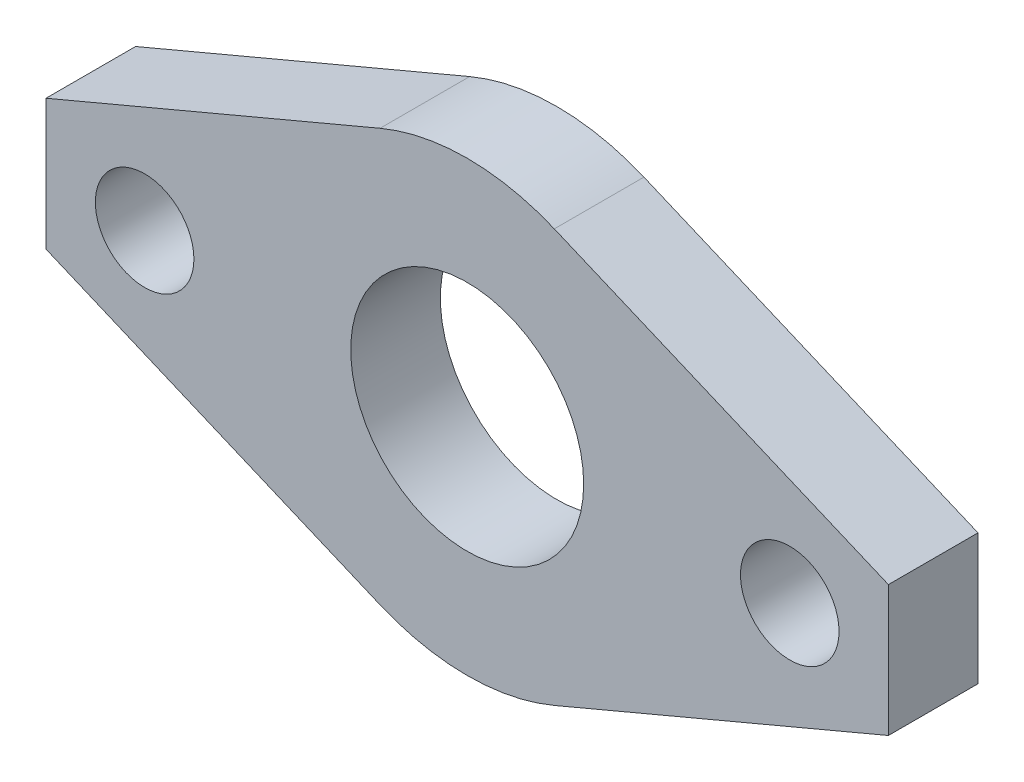
ISO-10303-21;
HEADER;
FILE_DESCRIPTION(('STEP AP214'),'2;1');
FILE_NAME('part.step','',(''),(''),'','','');
FILE_SCHEMA(('AUTOMOTIVE_DESIGN { 1 0 10303 214 1 1 1 1 }'));
ENDSEC;
DATA;
#1=APPLICATION_CONTEXT('core data for automotive mechanical design processes');
#2=APPLICATION_PROTOCOL_DEFINITION('international standard','automotive_design',2000,#1);
#3=PRODUCT_CONTEXT('',#1,'mechanical');
#4=PRODUCT('Part','Part','',(#3));
#5=PRODUCT_RELATED_PRODUCT_CATEGORY('part','',(#4));
#6=PRODUCT_DEFINITION_FORMATION('','',#4);
#7=PRODUCT_DEFINITION_CONTEXT('part definition',#1,'design');
#8=PRODUCT_DEFINITION('design','',#6,#7);
#9=PRODUCT_DEFINITION_SHAPE('','',#8);
#10=(LENGTH_UNIT() NAMED_UNIT(*) SI_UNIT(.MILLI.,.METRE.));
#11=(NAMED_UNIT(*) PLANE_ANGLE_UNIT() SI_UNIT($,.RADIAN.));
#12=(NAMED_UNIT(*) SI_UNIT($,.STERADIAN.) SOLID_ANGLE_UNIT());
#13=UNCERTAINTY_MEASURE_WITH_UNIT(LENGTH_MEASURE(1.E-05),#10,'distance_accuracy_value','');
#14=(GEOMETRIC_REPRESENTATION_CONTEXT(3) GLOBAL_UNCERTAINTY_ASSIGNED_CONTEXT((#13)) GLOBAL_UNIT_ASSIGNED_CONTEXT((#10,
#11,#12)) REPRESENTATION_CONTEXT('',''));
#15=CARTESIAN_POINT('',(0.,0.,0.));
#16=DIRECTION('',(0.,0.,1.));
#17=DIRECTION('',(1.,0.,0.));
#18=AXIS2_PLACEMENT_3D('',#15,#16,#17);
#19=CARTESIAN_POINT('',(0.,16.,5.));
#20=DIRECTION('',(0.,0.,1.));
#21=DIRECTION('',(1.,0.,0.));
#22=AXIS2_PLACEMENT_3D('',#19,#20,#21);
#23=PLANE('',#22);
#24=CARTESIAN_POINT('',(-18.,16.,5.));
#25=DIRECTION('',(0.,0.,1.));
#26=DIRECTION('',(1.,0.,0.));
#27=AXIS2_PLACEMENT_3D('',#24,#25,#26);
#28=CIRCLE('',#27,2.75);
#29=CARTESIAN_POINT('',(-15.25,16.,5.));
#30=VERTEX_POINT('',#29);
#31=EDGE_CURVE('E182',#30,#30,#28,.T.);
#32=ORIENTED_EDGE('',*,*,#31,.F.);
#33=EDGE_LOOP('',(#32));
#34=FACE_BOUND('',#33,.T.);
#35=CARTESIAN_POINT('',(0.,16.,5.));
#36=DIRECTION('',(0.,0.,1.));
#37=DIRECTION('',(1.,0.,0.));
#38=AXIS2_PLACEMENT_3D('',#35,#36,#37);
#39=CIRCLE('',#38,12.5);
#40=CARTESIAN_POINT('',(-4.86111111111111,4.48394170015486,5.));
#41=VERTEX_POINT('',#40);
#42=CARTESIAN_POINT('',(4.86111111111111,4.48394170015486,5.));
#43=VERTEX_POINT('',#42);
#44=EDGE_CURVE('E145',#41,#43,#39,.T.);
#45=ORIENTED_EDGE('',*,*,#44,.T.);
#46=DIRECTION('',(0.921284663987611,0.388888888888889,0.));
#47=VECTOR('',#46,1.);
#48=CARTESIAN_POINT('',(4.86111111111111,4.48394170015486,5.));
#49=LINE('',#48,#47);
#50=CARTESIAN_POINT('',(23.5036785252955,12.3532654945601,5.));
#51=VERTEX_POINT('',#50);
#52=EDGE_CURVE('E93',#43,#51,#49,.T.);
#53=ORIENTED_EDGE('',*,*,#52,.T.);
#54=DIRECTION('',(0.,1.,0.));
#55=VECTOR('',#54,1.);
#56=CARTESIAN_POINT('',(23.5036785252955,19.6467345054399,5.));
#57=LINE('',#56,#55);
#58=CARTESIAN_POINT('',(23.5036785252955,19.6467345054399,5.));
#59=VERTEX_POINT('',#58);
#60=EDGE_CURVE('E160',#51,#59,#57,.T.);
#61=ORIENTED_EDGE('',*,*,#60,.T.);
#62=DIRECTION('',(-0.921284663987611,0.388888888888889,0.));
#63=VECTOR('',#62,1.);
#64=CARTESIAN_POINT('',(4.86111111111111,27.5160582998451,5.));
#65=LINE('',#64,#63);
#66=CARTESIAN_POINT('',(4.86111111111111,27.5160582998451,5.));
#67=VERTEX_POINT('',#66);
#68=EDGE_CURVE('E173',#59,#67,#65,.T.);
#69=ORIENTED_EDGE('',*,*,#68,.T.);
#70=CARTESIAN_POINT('',(0.,16.,5.));
#71=DIRECTION('',(0.,0.,1.));
#72=DIRECTION('',(-1.,0.,0.));
#73=AXIS2_PLACEMENT_3D('',#70,#71,#72);
#74=CIRCLE('',#73,12.5);
#75=CARTESIAN_POINT('',(-4.86111111111111,27.5160582998451,5.));
#76=VERTEX_POINT('',#75);
#77=EDGE_CURVE('E112',#67,#76,#74,.T.);
#78=ORIENTED_EDGE('',*,*,#77,.T.);
#79=DIRECTION('',(-0.921284663987611,-0.388888888888889,0.));
#80=VECTOR('',#79,1.);
#81=CARTESIAN_POINT('',(-4.86111111111111,27.5160582998451,5.));
#82=LINE('',#81,#80);
#83=CARTESIAN_POINT('',(-23.5036785252955,19.6467345054399,5.));
#84=VERTEX_POINT('',#83);
#85=EDGE_CURVE('E106',#76,#84,#82,.T.);
#86=ORIENTED_EDGE('',*,*,#85,.T.);
#87=DIRECTION('',(0.,-1.,0.));
#88=VECTOR('',#87,1.);
#89=CARTESIAN_POINT('',(-23.5036785252955,19.6467345054399,5.));
#90=LINE('',#89,#88);
#91=CARTESIAN_POINT('',(-23.5036785252955,12.3532654945601,5.));
#92=VERTEX_POINT('',#91);
#93=EDGE_CURVE('E110',#84,#92,#90,.T.);
#94=ORIENTED_EDGE('',*,*,#93,.T.);
#95=DIRECTION('',(0.921284663987611,-0.388888888888889,0.));
#96=VECTOR('',#95,1.);
#97=CARTESIAN_POINT('',(-4.86111111111111,4.48394170015486,5.));
#98=LINE('',#97,#96);
#99=EDGE_CURVE('E50',#92,#41,#98,.T.);
#100=ORIENTED_EDGE('',*,*,#99,.T.);
#101=EDGE_LOOP('',(#45,#53,#61,#69,#78,#86,#94,#100));
#102=FACE_BOUND('',#101,.T.);
#103=CARTESIAN_POINT('',(0.,16.,5.));
#104=DIRECTION('',(0.,0.,1.));
#105=DIRECTION('',(1.,0.,0.));
#106=AXIS2_PLACEMENT_3D('',#103,#104,#105);
#107=CIRCLE('',#106,6.5);
#108=CARTESIAN_POINT('',(6.5,16.,5.));
#109=VERTEX_POINT('',#108);
#110=EDGE_CURVE('E134',#109,#109,#107,.T.);
#111=ORIENTED_EDGE('',*,*,#110,.F.);
#112=EDGE_LOOP('',(#111));
#113=FACE_BOUND('',#112,.T.);
#114=CARTESIAN_POINT('',(18.,16.,5.));
#115=DIRECTION('',(0.,0.,1.));
#116=DIRECTION('',(1.,0.,0.));
#117=AXIS2_PLACEMENT_3D('',#114,#115,#116);
#118=CIRCLE('',#117,2.75);
#119=CARTESIAN_POINT('',(20.75,16.,5.));
#120=VERTEX_POINT('',#119);
#121=EDGE_CURVE('E188',#120,#120,#118,.T.);
#122=ORIENTED_EDGE('',*,*,#121,.F.);
#123=EDGE_LOOP('',(#122));
#124=FACE_BOUND('',#123,.T.);
#125=ADVANCED_FACE('F33',(#34,#102,#113,#124),#23,.T.);
#126=CARTESIAN_POINT('',(0.,16.,0.));
#127=DIRECTION('',(0.,0.,1.));
#128=DIRECTION('',(1.,0.,0.));
#129=AXIS2_PLACEMENT_3D('',#126,#127,#128);
#130=PLANE('',#129);
#131=CARTESIAN_POINT('',(-18.,16.,0.));
#132=DIRECTION('',(0.,0.,1.));
#133=DIRECTION('',(1.,0.,0.));
#134=AXIS2_PLACEMENT_3D('',#131,#132,#133);
#135=CIRCLE('',#134,2.75);
#136=CARTESIAN_POINT('',(-15.25,16.,0.));
#137=VERTEX_POINT('',#136);
#138=EDGE_CURVE('E185',#137,#137,#135,.T.);
#139=ORIENTED_EDGE('',*,*,#138,.T.);
#140=EDGE_LOOP('',(#139));
#141=FACE_BOUND('',#140,.T.);
#142=CARTESIAN_POINT('',(0.,16.,0.));
#143=DIRECTION('',(0.,0.,1.));
#144=DIRECTION('',(1.,0.,0.));
#145=AXIS2_PLACEMENT_3D('',#142,#143,#144);
#146=CIRCLE('',#145,12.5);
#147=CARTESIAN_POINT('',(-4.86111111111111,4.48394170015486,0.));
#148=VERTEX_POINT('',#147);
#149=CARTESIAN_POINT('',(4.86111111111111,4.48394170015486,0.));
#150=VERTEX_POINT('',#149);
#151=EDGE_CURVE('E130',#148,#150,#146,.T.);
#152=ORIENTED_EDGE('',*,*,#151,.F.);
#153=DIRECTION('',(0.921284663987611,-0.388888888888889,0.));
#154=VECTOR('',#153,1.);
#155=CARTESIAN_POINT('',(-4.86111111111111,4.48394170015486,0.));
#156=LINE('',#155,#154);
#157=CARTESIAN_POINT('',(-23.5036785252955,12.3532654945601,0.));
#158=VERTEX_POINT('',#157);
#159=EDGE_CURVE('E85',#158,#148,#156,.T.);
#160=ORIENTED_EDGE('',*,*,#159,.F.);
#161=DIRECTION('',(0.,-1.,0.));
#162=VECTOR('',#161,1.);
#163=CARTESIAN_POINT('',(-23.5036785252955,19.6467345054399,0.));
#164=LINE('',#163,#162);
#165=CARTESIAN_POINT('',(-23.5036785252955,19.6467345054399,0.));
#166=VERTEX_POINT('',#165);
#167=EDGE_CURVE('E79',#166,#158,#164,.T.);
#168=ORIENTED_EDGE('',*,*,#167,.F.);
#169=DIRECTION('',(-0.921284663987611,-0.388888888888889,0.));
#170=VECTOR('',#169,1.);
#171=CARTESIAN_POINT('',(-4.86111111111111,27.5160582998451,0.));
#172=LINE('',#171,#170);
#173=CARTESIAN_POINT('',(-4.86111111111111,27.5160582998451,0.));
#174=VERTEX_POINT('',#173);
#175=EDGE_CURVE('E120',#174,#166,#172,.T.);
#176=ORIENTED_EDGE('',*,*,#175,.F.);
#177=CARTESIAN_POINT('',(0.,16.,0.));
#178=DIRECTION('',(0.,0.,1.));
#179=DIRECTION('',(-1.,0.,0.));
#180=AXIS2_PLACEMENT_3D('',#177,#178,#179);
#181=CIRCLE('',#180,12.5);
#182=CARTESIAN_POINT('',(4.86111111111111,27.5160582998451,0.));
#183=VERTEX_POINT('',#182);
#184=EDGE_CURVE('E140',#183,#174,#181,.T.);
#185=ORIENTED_EDGE('',*,*,#184,.F.);
#186=DIRECTION('',(-0.921284663987611,0.388888888888889,0.));
#187=VECTOR('',#186,1.);
#188=CARTESIAN_POINT('',(4.86111111111111,27.5160582998451,0.));
#189=LINE('',#188,#187);
#190=CARTESIAN_POINT('',(23.5036785252955,19.6467345054399,0.));
#191=VERTEX_POINT('',#190);
#192=EDGE_CURVE('E138',#191,#183,#189,.T.);
#193=ORIENTED_EDGE('',*,*,#192,.F.);
#194=DIRECTION('',(0.,1.,0.));
#195=VECTOR('',#194,1.);
#196=CARTESIAN_POINT('',(23.5036785252955,19.6467345054399,0.));
#197=LINE('',#196,#195);
#198=CARTESIAN_POINT('',(23.5036785252955,12.3532654945601,0.));
#199=VERTEX_POINT('',#198);
#200=EDGE_CURVE('E136',#199,#191,#197,.T.);
#201=ORIENTED_EDGE('',*,*,#200,.F.);
#202=DIRECTION('',(0.921284663987611,0.388888888888889,0.));
#203=VECTOR('',#202,1.);
#204=CARTESIAN_POINT('',(4.86111111111111,4.48394170015486,0.));
#205=LINE('',#204,#203);
#206=EDGE_CURVE('E133',#150,#199,#205,.T.);
#207=ORIENTED_EDGE('',*,*,#206,.F.);
#208=EDGE_LOOP('',(#152,#160,#168,#176,#185,#193,#201,#207));
#209=FACE_BOUND('',#208,.T.);
#210=CARTESIAN_POINT('',(0.,16.,0.));
#211=DIRECTION('',(0.,0.,1.));
#212=DIRECTION('',(1.,0.,0.));
#213=AXIS2_PLACEMENT_3D('',#210,#211,#212);
#214=CIRCLE('',#213,6.5);
#215=CARTESIAN_POINT('',(6.5,16.,0.));
#216=VERTEX_POINT('',#215);
#217=EDGE_CURVE('E179',#216,#216,#214,.T.);
#218=ORIENTED_EDGE('',*,*,#217,.T.);
#219=EDGE_LOOP('',(#218));
#220=FACE_BOUND('',#219,.T.);
#221=CARTESIAN_POINT('',(18.,16.,0.));
#222=DIRECTION('',(0.,0.,1.));
#223=DIRECTION('',(1.,0.,0.));
#224=AXIS2_PLACEMENT_3D('',#221,#222,#223);
#225=CIRCLE('',#224,2.75);
#226=CARTESIAN_POINT('',(20.75,16.,0.));
#227=VERTEX_POINT('',#226);
#228=EDGE_CURVE('E191',#227,#227,#225,.T.);
#229=ORIENTED_EDGE('',*,*,#228,.T.);
#230=EDGE_LOOP('',(#229));
#231=FACE_BOUND('',#230,.T.);
#232=ADVANCED_FACE('F164',(#141,#209,#220,#231),#130,.F.);
#233=CARTESIAN_POINT('',(0.,16.,5.));
#234=DIRECTION('',(0.,0.,-1.));
#235=DIRECTION('',(-1.,0.,0.));
#236=AXIS2_PLACEMENT_3D('',#233,#234,#235);
#237=CYLINDRICAL_SURFACE('',#236,12.5);
#238=ORIENTED_EDGE('',*,*,#151,.T.);
#239=DIRECTION('',(0.,0.,-1.));
#240=VECTOR('',#239,1.);
#241=CARTESIAN_POINT('',(4.86111111111111,4.48394170015486,5.));
#242=LINE('',#241,#240);
#243=EDGE_CURVE('E11',#43,#150,#242,.T.);
#244=ORIENTED_EDGE('',*,*,#243,.F.);
#245=ORIENTED_EDGE('',*,*,#44,.F.);
#246=DIRECTION('',(0.,0.,-1.));
#247=VECTOR('',#246,1.);
#248=CARTESIAN_POINT('',(-4.86111111111111,4.48394170015486,5.));
#249=LINE('',#248,#247);
#250=EDGE_CURVE('E126',#41,#148,#249,.T.);
#251=ORIENTED_EDGE('',*,*,#250,.T.);
#252=EDGE_LOOP('',(#238,#244,#245,#251));
#253=FACE_BOUND('',#252,.T.);
#254=ADVANCED_FACE('F35',(#253),#237,.T.);
#255=CARTESIAN_POINT('',(4.86111111111111,4.48394170015486,5.));
#256=DIRECTION('',(-0.388888888888889,0.921284663987611,0.));
#257=DIRECTION('',(-0.921284663987611,-0.388888888888889,0.));
#258=AXIS2_PLACEMENT_3D('',#255,#256,#257);
#259=PLANE('',#258);
#260=ORIENTED_EDGE('',*,*,#206,.T.);
#261=DIRECTION('',(0.,0.,-1.));
#262=VECTOR('',#261,1.);
#263=CARTESIAN_POINT('',(23.5036785252955,12.3532654945601,5.));
#264=LINE('',#263,#262);
#265=EDGE_CURVE('E42',#51,#199,#264,.T.);
#266=ORIENTED_EDGE('',*,*,#265,.F.);
#267=ORIENTED_EDGE('',*,*,#52,.F.);
#268=ORIENTED_EDGE('',*,*,#243,.T.);
#269=EDGE_LOOP('',(#260,#266,#267,#268));
#270=FACE_BOUND('',#269,.T.);
#271=ADVANCED_FACE('F225',(#270),#259,.F.);
#272=CARTESIAN_POINT('',(23.5036785252955,19.6467345054399,5.));
#273=DIRECTION('',(-1.,0.,0.));
#274=DIRECTION('',(0.,0.,1.));
#275=AXIS2_PLACEMENT_3D('',#272,#273,#274);
#276=PLANE('',#275);
#277=ORIENTED_EDGE('',*,*,#200,.T.);
#278=DIRECTION('',(0.,0.,-1.));
#279=VECTOR('',#278,1.);
#280=CARTESIAN_POINT('',(23.5036785252955,19.6467345054399,5.));
#281=LINE('',#280,#279);
#282=EDGE_CURVE('E152',#59,#191,#281,.T.);
#283=ORIENTED_EDGE('',*,*,#282,.F.);
#284=ORIENTED_EDGE('',*,*,#60,.F.);
#285=ORIENTED_EDGE('',*,*,#265,.T.);
#286=EDGE_LOOP('',(#277,#283,#284,#285));
#287=FACE_BOUND('',#286,.T.);
#288=ADVANCED_FACE('F158',(#287),#276,.F.);
#289=CARTESIAN_POINT('',(4.86111111111111,27.5160582998451,5.));
#290=DIRECTION('',(-0.388888888888889,-0.921284663987611,0.));
#291=DIRECTION('',(0.921284663987611,-0.388888888888889,0.));
#292=AXIS2_PLACEMENT_3D('',#289,#290,#291);
#293=PLANE('',#292);
#294=ORIENTED_EDGE('',*,*,#192,.T.);
#295=DIRECTION('',(0.,0.,-1.));
#296=VECTOR('',#295,1.);
#297=CARTESIAN_POINT('',(4.86111111111111,27.5160582998451,5.));
#298=LINE('',#297,#296);
#299=EDGE_CURVE('E149',#67,#183,#298,.T.);
#300=ORIENTED_EDGE('',*,*,#299,.F.);
#301=ORIENTED_EDGE('',*,*,#68,.F.);
#302=ORIENTED_EDGE('',*,*,#282,.T.);
#303=EDGE_LOOP('',(#294,#300,#301,#302));
#304=FACE_BOUND('',#303,.T.);
#305=ADVANCED_FACE('F169',(#304),#293,.F.);
#306=CARTESIAN_POINT('',(0.,16.,5.));
#307=DIRECTION('',(0.,0.,-1.));
#308=DIRECTION('',(-1.,0.,0.));
#309=AXIS2_PLACEMENT_3D('',#306,#307,#308);
#310=CYLINDRICAL_SURFACE('',#309,12.5);
#311=ORIENTED_EDGE('',*,*,#184,.T.);
#312=DIRECTION('',(0.,0.,-1.));
#313=VECTOR('',#312,1.);
#314=CARTESIAN_POINT('',(-4.86111111111111,27.5160582998451,5.));
#315=LINE('',#314,#313);
#316=EDGE_CURVE('E121',#76,#174,#315,.T.);
#317=ORIENTED_EDGE('',*,*,#316,.F.);
#318=ORIENTED_EDGE('',*,*,#77,.F.);
#319=ORIENTED_EDGE('',*,*,#299,.T.);
#320=EDGE_LOOP('',(#311,#317,#318,#319));
#321=FACE_BOUND('',#320,.T.);
#322=ADVANCED_FACE('F172',(#321),#310,.T.);
#323=CARTESIAN_POINT('',(-4.86111111111111,27.5160582998451,5.));
#324=DIRECTION('',(0.388888888888889,-0.921284663987611,0.));
#325=DIRECTION('',(0.921284663987611,0.388888888888889,0.));
#326=AXIS2_PLACEMENT_3D('',#323,#324,#325);
#327=PLANE('',#326);
#328=ORIENTED_EDGE('',*,*,#175,.T.);
#329=DIRECTION('',(0.,0.,-1.));
#330=VECTOR('',#329,1.);
#331=CARTESIAN_POINT('',(-23.5036785252955,19.6467345054399,5.));
#332=LINE('',#331,#330);
#333=EDGE_CURVE('E117',#84,#166,#332,.T.);
#334=ORIENTED_EDGE('',*,*,#333,.F.);
#335=ORIENTED_EDGE('',*,*,#85,.F.);
#336=ORIENTED_EDGE('',*,*,#316,.T.);
#337=EDGE_LOOP('',(#328,#334,#335,#336));
#338=FACE_BOUND('',#337,.T.);
#339=ADVANCED_FACE('F118',(#338),#327,.F.);
#340=CARTESIAN_POINT('',(-23.5036785252955,19.6467345054399,5.));
#341=DIRECTION('',(1.,0.,0.));
#342=DIRECTION('',(0.,0.,-1.));
#343=AXIS2_PLACEMENT_3D('',#340,#341,#342);
#344=PLANE('',#343);
#345=ORIENTED_EDGE('',*,*,#167,.T.);
#346=DIRECTION('',(0.,0.,-1.));
#347=VECTOR('',#346,1.);
#348=CARTESIAN_POINT('',(-23.5036785252955,12.3532654945601,5.));
#349=LINE('',#348,#347);
#350=EDGE_CURVE('E122',#92,#158,#349,.T.);
#351=ORIENTED_EDGE('',*,*,#350,.F.);
#352=ORIENTED_EDGE('',*,*,#93,.F.);
#353=ORIENTED_EDGE('',*,*,#333,.T.);
#354=EDGE_LOOP('',(#345,#351,#352,#353));
#355=FACE_BOUND('',#354,.T.);
#356=ADVANCED_FACE('F124',(#355),#344,.F.);
#357=CARTESIAN_POINT('',(-4.86111111111111,4.48394170015486,5.));
#358=DIRECTION('',(0.388888888888889,0.921284663987611,0.));
#359=DIRECTION('',(-0.921284663987611,0.388888888888889,0.));
#360=AXIS2_PLACEMENT_3D('',#357,#358,#359);
#361=PLANE('',#360);
#362=ORIENTED_EDGE('',*,*,#159,.T.);
#363=ORIENTED_EDGE('',*,*,#250,.F.);
#364=ORIENTED_EDGE('',*,*,#99,.F.);
#365=ORIENTED_EDGE('',*,*,#350,.T.);
#366=EDGE_LOOP('',(#362,#363,#364,#365));
#367=FACE_BOUND('',#366,.T.);
#368=ADVANCED_FACE('F213',(#367),#361,.F.);
#369=CARTESIAN_POINT('',(0.,16.,5.));
#370=DIRECTION('',(0.,0.,-1.));
#371=DIRECTION('',(-1.,0.,0.));
#372=AXIS2_PLACEMENT_3D('',#369,#370,#371);
#373=CYLINDRICAL_SURFACE('',#372,6.5);
#374=ORIENTED_EDGE('',*,*,#110,.T.);
#375=EDGE_LOOP('',(#374));
#376=FACE_BOUND('',#375,.T.);
#377=ORIENTED_EDGE('',*,*,#217,.F.);
#378=EDGE_LOOP('',(#377));
#379=FACE_BOUND('',#378,.T.);
#380=ADVANCED_FACE('F210',(#376,#379),#373,.F.);
#381=CARTESIAN_POINT('',(-18.,16.,5.));
#382=DIRECTION('',(0.,0.,-1.));
#383=DIRECTION('',(-1.,0.,0.));
#384=AXIS2_PLACEMENT_3D('',#381,#382,#383);
#385=CYLINDRICAL_SURFACE('',#384,2.75);
#386=ORIENTED_EDGE('',*,*,#31,.T.);
#387=EDGE_LOOP('',(#386));
#388=FACE_BOUND('',#387,.T.);
#389=ORIENTED_EDGE('',*,*,#138,.F.);
#390=EDGE_LOOP('',(#389));
#391=FACE_BOUND('',#390,.T.);
#392=ADVANCED_FACE('F289',(#388,#391),#385,.F.);
#393=CARTESIAN_POINT('',(18.,16.,5.));
#394=DIRECTION('',(0.,0.,-1.));
#395=DIRECTION('',(-1.,0.,0.));
#396=AXIS2_PLACEMENT_3D('',#393,#394,#395);
#397=CYLINDRICAL_SURFACE('',#396,2.75);
#398=ORIENTED_EDGE('',*,*,#121,.T.);
#399=EDGE_LOOP('',(#398));
#400=FACE_BOUND('',#399,.T.);
#401=ORIENTED_EDGE('',*,*,#228,.F.);
#402=EDGE_LOOP('',(#401));
#403=FACE_BOUND('',#402,.T.);
#404=ADVANCED_FACE('F197',(#400,#403),#397,.F.);
#405=CLOSED_SHELL('',(#125,#232,#254,#271,#288,#305,#322,#339,#356,#368,#380,#392,#404));
#406=MANIFOLD_SOLID_BREP('B2',#405);
#407=ADVANCED_BREP_SHAPE_REPRESENTATION('',(#18,#406),#14);
#408=SHAPE_DEFINITION_REPRESENTATION(#9,#407);
ENDSEC;
END-ISO-10303-21;
